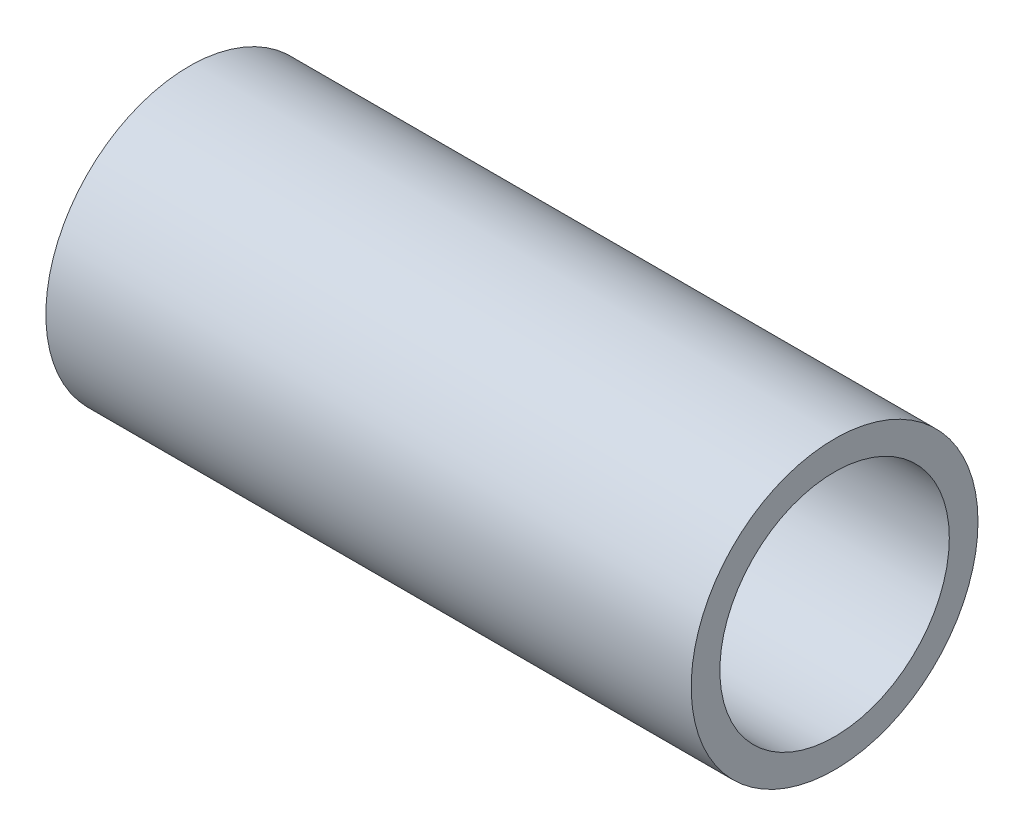
ISO-10303-21;
HEADER;
FILE_DESCRIPTION(('STEP AP214'),'2;1');
FILE_NAME('part.step','',(''),(''),'','','');
FILE_SCHEMA(('AUTOMOTIVE_DESIGN { 1 0 10303 214 1 1 1 1 }'));
ENDSEC;
DATA;
#1=APPLICATION_CONTEXT('core data for automotive mechanical design processes');
#2=APPLICATION_PROTOCOL_DEFINITION('international standard','automotive_design',2000,#1);
#3=PRODUCT_CONTEXT('',#1,'mechanical');
#4=PRODUCT('Part','Part','',(#3));
#5=PRODUCT_RELATED_PRODUCT_CATEGORY('part','',(#4));
#6=PRODUCT_DEFINITION_FORMATION('','',#4);
#7=PRODUCT_DEFINITION_CONTEXT('part definition',#1,'design');
#8=PRODUCT_DEFINITION('design','',#6,#7);
#9=PRODUCT_DEFINITION_SHAPE('','',#8);
#10=(LENGTH_UNIT() NAMED_UNIT(*) SI_UNIT(.MILLI.,.METRE.));
#11=(NAMED_UNIT(*) PLANE_ANGLE_UNIT() SI_UNIT($,.RADIAN.));
#12=(NAMED_UNIT(*) SI_UNIT($,.STERADIAN.) SOLID_ANGLE_UNIT());
#13=UNCERTAINTY_MEASURE_WITH_UNIT(LENGTH_MEASURE(1.E-05),#10,'distance_accuracy_value','');
#14=(GEOMETRIC_REPRESENTATION_CONTEXT(3) GLOBAL_UNCERTAINTY_ASSIGNED_CONTEXT((#13)) GLOBAL_UNIT_ASSIGNED_CONTEXT((#10,
#11,#12)) REPRESENTATION_CONTEXT('',''));
#15=CARTESIAN_POINT('',(0.,0.,0.));
#16=DIRECTION('',(0.,0.,1.));
#17=DIRECTION('',(1.,0.,0.));
#18=AXIS2_PLACEMENT_3D('',#15,#16,#17);
#19=CARTESIAN_POINT('',(14.2875,0.,0.));
#20=DIRECTION('',(-1.,0.,0.));
#21=DIRECTION('',(0.,0.,1.));
#22=AXIS2_PLACEMENT_3D('',#19,#20,#21);
#23=CYLINDRICAL_SURFACE('',#22,3.175);
#24=CARTESIAN_POINT('',(14.2875,0.,0.));
#25=DIRECTION('',(1.,0.,0.));
#26=DIRECTION('',(0.,0.,-1.));
#27=AXIS2_PLACEMENT_3D('',#24,#25,#26);
#28=CIRCLE('',#27,3.175);
#29=CARTESIAN_POINT('',(14.2875,0.,-3.175));
#30=VERTEX_POINT('',#29);
#31=EDGE_CURVE('E10',#30,#30,#28,.T.);
#32=ORIENTED_EDGE('',*,*,#31,.F.);
#33=EDGE_LOOP('',(#32));
#34=FACE_BOUND('',#33,.T.);
#35=CARTESIAN_POINT('',(0.,0.,0.));
#36=DIRECTION('',(1.,0.,0.));
#37=DIRECTION('',(0.,0.,-1.));
#38=AXIS2_PLACEMENT_3D('',#35,#36,#37);
#39=CIRCLE('',#38,3.175);
#40=CARTESIAN_POINT('',(0.,0.,-3.175));
#41=VERTEX_POINT('',#40);
#42=EDGE_CURVE('E37',#41,#41,#39,.T.);
#43=ORIENTED_EDGE('',*,*,#42,.T.);
#44=EDGE_LOOP('',(#43));
#45=FACE_BOUND('',#44,.T.);
#46=ADVANCED_FACE('F34',(#34,#45),#23,.T.);
#47=CARTESIAN_POINT('',(14.2875,0.,0.));
#48=DIRECTION('',(1.,0.,0.));
#49=DIRECTION('',(0.,0.,-1.));
#50=AXIS2_PLACEMENT_3D('',#47,#48,#49);
#51=PLANE('',#50);
#52=CARTESIAN_POINT('',(14.2875,0.,0.));
#53=DIRECTION('',(1.,0.,0.));
#54=DIRECTION('',(0.,0.,-1.));
#55=AXIS2_PLACEMENT_3D('',#52,#53,#54);
#56=CIRCLE('',#55,2.54);
#57=CARTESIAN_POINT('',(14.2875,0.,-2.54));
#58=VERTEX_POINT('',#57);
#59=EDGE_CURVE('E46',#58,#58,#56,.T.);
#60=ORIENTED_EDGE('',*,*,#59,.F.);
#61=EDGE_LOOP('',(#60));
#62=FACE_BOUND('',#61,.T.);
#63=ORIENTED_EDGE('',*,*,#31,.T.);
#64=EDGE_LOOP('',(#63));
#65=FACE_BOUND('',#64,.T.);
#66=ADVANCED_FACE('F61',(#62,#65),#51,.T.);
#67=CARTESIAN_POINT('',(0.,0.,0.));
#68=DIRECTION('',(1.,0.,0.));
#69=DIRECTION('',(0.,0.,-1.));
#70=AXIS2_PLACEMENT_3D('',#67,#68,#69);
#71=PLANE('',#70);
#72=CARTESIAN_POINT('',(0.,0.,0.));
#73=DIRECTION('',(1.,0.,0.));
#74=DIRECTION('',(0.,0.,-1.));
#75=AXIS2_PLACEMENT_3D('',#72,#73,#74);
#76=CIRCLE('',#75,2.54);
#77=CARTESIAN_POINT('',(0.,0.,-2.54));
#78=VERTEX_POINT('',#77);
#79=EDGE_CURVE('E44',#78,#78,#76,.T.);
#80=ORIENTED_EDGE('',*,*,#79,.T.);
#81=EDGE_LOOP('',(#80));
#82=FACE_BOUND('',#81,.T.);
#83=ORIENTED_EDGE('',*,*,#42,.F.);
#84=EDGE_LOOP('',(#83));
#85=FACE_BOUND('',#84,.T.);
#86=ADVANCED_FACE('F52',(#82,#85),#71,.F.);
#87=CARTESIAN_POINT('',(0.,0.,0.));
#88=DIRECTION('',(1.,0.,0.));
#89=DIRECTION('',(0.,0.,-1.));
#90=AXIS2_PLACEMENT_3D('',#87,#88,#89);
#91=CYLINDRICAL_SURFACE('',#90,2.54);
#92=ORIENTED_EDGE('',*,*,#79,.F.);
#93=EDGE_LOOP('',(#92));
#94=FACE_BOUND('',#93,.T.);
#95=ORIENTED_EDGE('',*,*,#59,.T.);
#96=EDGE_LOOP('',(#95));
#97=FACE_BOUND('',#96,.T.);
#98=ADVANCED_FACE('F55',(#94,#97),#91,.F.);
#99=CLOSED_SHELL('',(#46,#66,#86,#98));
#100=MANIFOLD_SOLID_BREP('B2',#99);
#101=ADVANCED_BREP_SHAPE_REPRESENTATION('',(#18,#100),#14);
#102=SHAPE_DEFINITION_REPRESENTATION(#9,#101);
ENDSEC;
END-ISO-10303-21;
